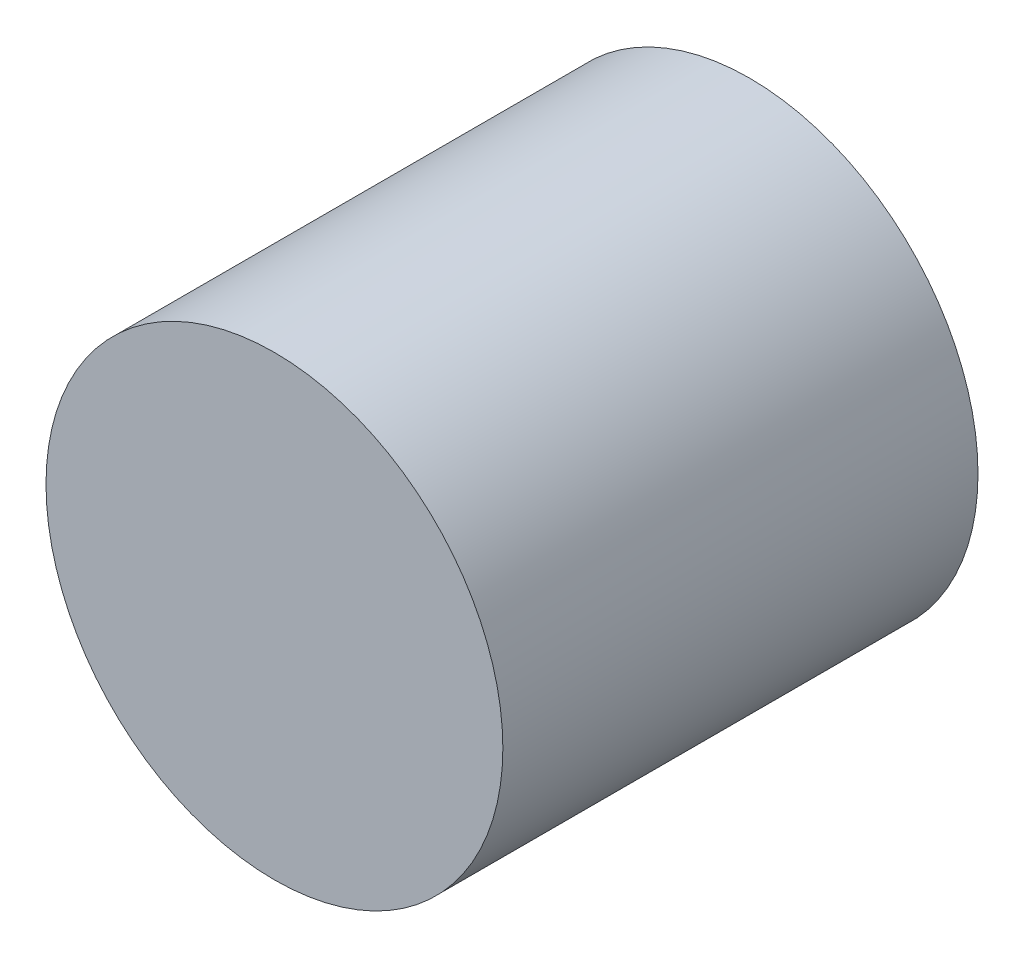
ISO-10303-21;
HEADER;
FILE_DESCRIPTION(('STEP AP214'),'2;1');
FILE_NAME('part.step','',(''),(''),'','','');
FILE_SCHEMA(('AUTOMOTIVE_DESIGN { 1 0 10303 214 1 1 1 1 }'));
ENDSEC;
DATA;
#1=APPLICATION_CONTEXT('core data for automotive mechanical design processes');
#2=APPLICATION_PROTOCOL_DEFINITION('international standard','automotive_design',2000,#1);
#3=PRODUCT_CONTEXT('',#1,'mechanical');
#4=PRODUCT('Part','Part','',(#3));
#5=PRODUCT_RELATED_PRODUCT_CATEGORY('part','',(#4));
#6=PRODUCT_DEFINITION_FORMATION('','',#4);
#7=PRODUCT_DEFINITION_CONTEXT('part definition',#1,'design');
#8=PRODUCT_DEFINITION('design','',#6,#7);
#9=PRODUCT_DEFINITION_SHAPE('','',#8);
#10=(LENGTH_UNIT() NAMED_UNIT(*) SI_UNIT(.MILLI.,.METRE.));
#11=(NAMED_UNIT(*) PLANE_ANGLE_UNIT() SI_UNIT($,.RADIAN.));
#12=(NAMED_UNIT(*) SI_UNIT($,.STERADIAN.) SOLID_ANGLE_UNIT());
#13=UNCERTAINTY_MEASURE_WITH_UNIT(LENGTH_MEASURE(1.E-05),#10,'distance_accuracy_value','');
#14=(GEOMETRIC_REPRESENTATION_CONTEXT(3) GLOBAL_UNCERTAINTY_ASSIGNED_CONTEXT((#13)) GLOBAL_UNIT_ASSIGNED_CONTEXT((#10,
#11,#12)) REPRESENTATION_CONTEXT('',''));
#15=CARTESIAN_POINT('',(0.,0.,0.));
#16=DIRECTION('',(0.,0.,1.));
#17=DIRECTION('',(1.,0.,0.));
#18=AXIS2_PLACEMENT_3D('',#15,#16,#17);
#19=CARTESIAN_POINT('',(0.,0.,9.906));
#20=DIRECTION('',(0.,0.,-1.));
#21=DIRECTION('',(-1.,0.,0.));
#22=AXIS2_PLACEMENT_3D('',#19,#20,#21);
#23=CYLINDRICAL_SURFACE('',#22,4.7625);
#24=CARTESIAN_POINT('',(0.,0.,9.906));
#25=DIRECTION('',(0.,0.,1.));
#26=DIRECTION('',(1.,0.,0.));
#27=AXIS2_PLACEMENT_3D('',#24,#25,#26);
#28=CIRCLE('',#27,4.7625);
#29=CARTESIAN_POINT('',(4.7625,0.,9.906));
#30=VERTEX_POINT('',#29);
#31=EDGE_CURVE('E10',#30,#30,#28,.T.);
#32=ORIENTED_EDGE('',*,*,#31,.F.);
#33=EDGE_LOOP('',(#32));
#34=FACE_BOUND('',#33,.T.);
#35=CARTESIAN_POINT('',(0.,0.,0.));
#36=DIRECTION('',(0.,0.,1.));
#37=DIRECTION('',(1.,0.,0.));
#38=AXIS2_PLACEMENT_3D('',#35,#36,#37);
#39=CIRCLE('',#38,4.7625);
#40=CARTESIAN_POINT('',(4.7625,0.,0.));
#41=VERTEX_POINT('',#40);
#42=EDGE_CURVE('E44',#41,#41,#39,.T.);
#43=ORIENTED_EDGE('',*,*,#42,.T.);
#44=EDGE_LOOP('',(#43));
#45=FACE_BOUND('',#44,.T.);
#46=ADVANCED_FACE('F41',(#34,#45),#23,.T.);
#47=CARTESIAN_POINT('',(0.,0.,9.906));
#48=DIRECTION('',(0.,0.,1.));
#49=DIRECTION('',(1.,0.,0.));
#50=AXIS2_PLACEMENT_3D('',#47,#48,#49);
#51=PLANE('',#50);
#52=ORIENTED_EDGE('',*,*,#31,.T.);
#53=EDGE_LOOP('',(#52));
#54=FACE_BOUND('',#53,.T.);
#55=ADVANCED_FACE('F58',(#54),#51,.T.);
#56=CARTESIAN_POINT('',(0.,0.,0.));
#57=DIRECTION('',(0.,0.,1.));
#58=DIRECTION('',(1.,0.,0.));
#59=AXIS2_PLACEMENT_3D('',#56,#57,#58);
#60=PLANE('',#59);
#61=ORIENTED_EDGE('',*,*,#42,.F.);
#62=EDGE_LOOP('',(#61));
#63=FACE_BOUND('',#62,.T.);
#64=ADVANCED_FACE('F56',(#63),#60,.F.);
#65=CLOSED_SHELL('',(#46,#55,#64));
#66=MANIFOLD_SOLID_BREP('B2',#65);
#67=ADVANCED_BREP_SHAPE_REPRESENTATION('',(#18,#66),#14);
#68=SHAPE_DEFINITION_REPRESENTATION(#9,#67);
ENDSEC;
END-ISO-10303-21;
